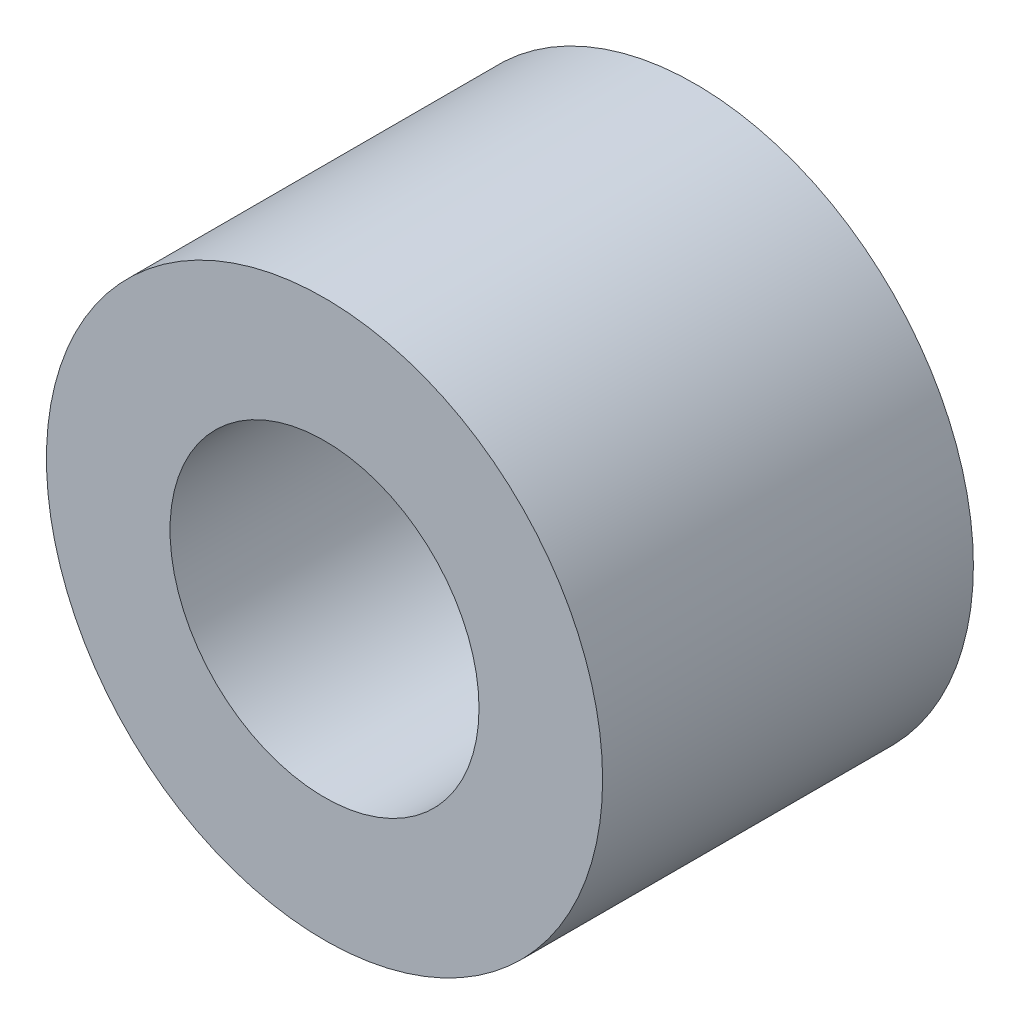
ISO-10303-21;
HEADER;
FILE_DESCRIPTION(('STEP AP214'),'2;1');
FILE_NAME('part.step','',(''),(''),'','','');
FILE_SCHEMA(('AUTOMOTIVE_DESIGN { 1 0 10303 214 1 1 1 1 }'));
ENDSEC;
DATA;
#1=APPLICATION_CONTEXT('core data for automotive mechanical design processes');
#2=APPLICATION_PROTOCOL_DEFINITION('international standard','automotive_design',2000,#1);
#3=PRODUCT_CONTEXT('',#1,'mechanical');
#4=PRODUCT('Part','Part','',(#3));
#5=PRODUCT_RELATED_PRODUCT_CATEGORY('part','',(#4));
#6=PRODUCT_DEFINITION_FORMATION('','',#4);
#7=PRODUCT_DEFINITION_CONTEXT('part definition',#1,'design');
#8=PRODUCT_DEFINITION('design','',#6,#7);
#9=PRODUCT_DEFINITION_SHAPE('','',#8);
#10=(LENGTH_UNIT() NAMED_UNIT(*) SI_UNIT(.MILLI.,.METRE.));
#11=(NAMED_UNIT(*) PLANE_ANGLE_UNIT() SI_UNIT($,.RADIAN.));
#12=(NAMED_UNIT(*) SI_UNIT($,.STERADIAN.) SOLID_ANGLE_UNIT());
#13=UNCERTAINTY_MEASURE_WITH_UNIT(LENGTH_MEASURE(1.E-05),#10,'distance_accuracy_value','');
#14=(GEOMETRIC_REPRESENTATION_CONTEXT(3) GLOBAL_UNCERTAINTY_ASSIGNED_CONTEXT((#13)) GLOBAL_UNIT_ASSIGNED_CONTEXT((#10,
#11,#12)) REPRESENTATION_CONTEXT('',''));
#15=CARTESIAN_POINT('',(0.,0.,0.));
#16=DIRECTION('',(0.,0.,1.));
#17=DIRECTION('',(1.,0.,0.));
#18=AXIS2_PLACEMENT_3D('',#15,#16,#17);
#19=CARTESIAN_POINT('',(0.,0.,6.));
#20=DIRECTION('',(0.,0.,1.));
#21=DIRECTION('',(1.,0.,0.));
#22=AXIS2_PLACEMENT_3D('',#19,#20,#21);
#23=PLANE('',#22);
#24=CARTESIAN_POINT('',(0.,0.,6.));
#25=DIRECTION('',(0.,0.,1.));
#26=DIRECTION('',(1.,0.,0.));
#27=AXIS2_PLACEMENT_3D('',#24,#25,#26);
#28=CIRCLE('',#27,4.5);
#29=CARTESIAN_POINT('',(4.5,0.,6.));
#30=VERTEX_POINT('',#29);
#31=EDGE_CURVE('E10',#30,#30,#28,.T.);
#32=ORIENTED_EDGE('',*,*,#31,.T.);
#33=EDGE_LOOP('',(#32));
#34=FACE_BOUND('',#33,.T.);
#35=CARTESIAN_POINT('',(0.,0.,6.));
#36=DIRECTION('',(0.,0.,1.));
#37=DIRECTION('',(1.,0.,0.));
#38=AXIS2_PLACEMENT_3D('',#35,#36,#37);
#39=CIRCLE('',#38,2.5);
#40=CARTESIAN_POINT('',(2.5,0.,6.));
#41=VERTEX_POINT('',#40);
#42=EDGE_CURVE('E52',#41,#41,#39,.T.);
#43=ORIENTED_EDGE('',*,*,#42,.F.);
#44=EDGE_LOOP('',(#43));
#45=FACE_BOUND('',#44,.T.);
#46=ADVANCED_FACE('F41',(#34,#45),#23,.T.);
#47=CARTESIAN_POINT('',(0.,0.,0.));
#48=DIRECTION('',(0.,0.,1.));
#49=DIRECTION('',(1.,0.,0.));
#50=AXIS2_PLACEMENT_3D('',#47,#48,#49);
#51=PLANE('',#50);
#52=CARTESIAN_POINT('',(0.,0.,0.));
#53=DIRECTION('',(0.,0.,1.));
#54=DIRECTION('',(1.,0.,0.));
#55=AXIS2_PLACEMENT_3D('',#52,#53,#54);
#56=CIRCLE('',#55,4.5);
#57=CARTESIAN_POINT('',(4.5,0.,0.));
#58=VERTEX_POINT('',#57);
#59=EDGE_CURVE('E45',#58,#58,#56,.T.);
#60=ORIENTED_EDGE('',*,*,#59,.F.);
#61=EDGE_LOOP('',(#60));
#62=FACE_BOUND('',#61,.T.);
#63=CARTESIAN_POINT('',(0.,0.,0.));
#64=DIRECTION('',(0.,0.,1.));
#65=DIRECTION('',(1.,0.,0.));
#66=AXIS2_PLACEMENT_3D('',#63,#64,#65);
#67=CIRCLE('',#66,2.5);
#68=CARTESIAN_POINT('',(2.5,0.,0.));
#69=VERTEX_POINT('',#68);
#70=EDGE_CURVE('E54',#69,#69,#67,.T.);
#71=ORIENTED_EDGE('',*,*,#70,.T.);
#72=EDGE_LOOP('',(#71));
#73=FACE_BOUND('',#72,.T.);
#74=ADVANCED_FACE('F64',(#62,#73),#51,.F.);
#75=CARTESIAN_POINT('',(0.,0.,6.));
#76=DIRECTION('',(0.,0.,-1.));
#77=DIRECTION('',(-1.,0.,0.));
#78=AXIS2_PLACEMENT_3D('',#75,#76,#77);
#79=CYLINDRICAL_SURFACE('',#78,4.5);
#80=ORIENTED_EDGE('',*,*,#31,.F.);
#81=EDGE_LOOP('',(#80));
#82=FACE_BOUND('',#81,.T.);
#83=ORIENTED_EDGE('',*,*,#59,.T.);
#84=EDGE_LOOP('',(#83));
#85=FACE_BOUND('',#84,.T.);
#86=ADVANCED_FACE('F43',(#82,#85),#79,.T.);
#87=CARTESIAN_POINT('',(0.,0.,6.));
#88=DIRECTION('',(0.,0.,-1.));
#89=DIRECTION('',(-1.,0.,0.));
#90=AXIS2_PLACEMENT_3D('',#87,#88,#89);
#91=CYLINDRICAL_SURFACE('',#90,2.5);
#92=ORIENTED_EDGE('',*,*,#42,.T.);
#93=EDGE_LOOP('',(#92));
#94=FACE_BOUND('',#93,.T.);
#95=ORIENTED_EDGE('',*,*,#70,.F.);
#96=EDGE_LOOP('',(#95));
#97=FACE_BOUND('',#96,.T.);
#98=ADVANCED_FACE('F60',(#94,#97),#91,.F.);
#99=CLOSED_SHELL('',(#46,#74,#86,#98));
#100=MANIFOLD_SOLID_BREP('B2',#99);
#101=ADVANCED_BREP_SHAPE_REPRESENTATION('',(#18,#100),#14);
#102=SHAPE_DEFINITION_REPRESENTATION(#9,#101);
ENDSEC;
END-ISO-10303-21;
